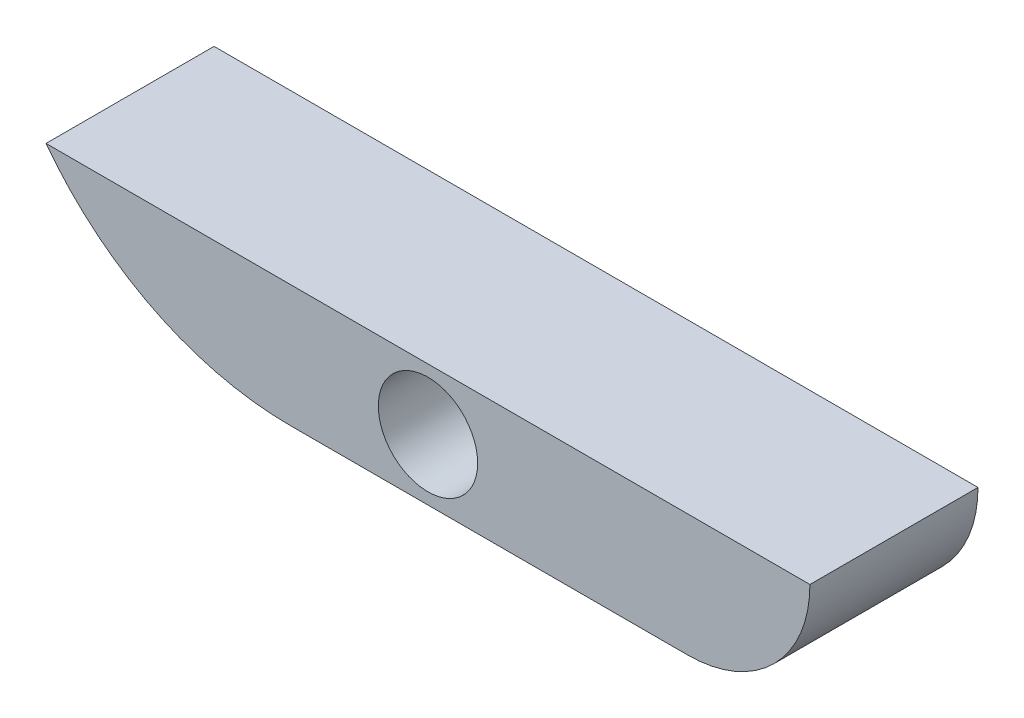
ISO-10303-21;
HEADER;
FILE_DESCRIPTION(('STEP AP214'),'2;1');
FILE_NAME('part.step','',(''),(''),'','','');
FILE_SCHEMA(('AUTOMOTIVE_DESIGN { 1 0 10303 214 1 1 1 1 }'));
ENDSEC;
DATA;
#1=APPLICATION_CONTEXT('core data for automotive mechanical design processes');
#2=APPLICATION_PROTOCOL_DEFINITION('international standard','automotive_design',2000,#1);
#3=PRODUCT_CONTEXT('',#1,'mechanical');
#4=PRODUCT('Part','Part','',(#3));
#5=PRODUCT_RELATED_PRODUCT_CATEGORY('part','',(#4));
#6=PRODUCT_DEFINITION_FORMATION('','',#4);
#7=PRODUCT_DEFINITION_CONTEXT('part definition',#1,'design');
#8=PRODUCT_DEFINITION('design','',#6,#7);
#9=PRODUCT_DEFINITION_SHAPE('','',#8);
#10=(LENGTH_UNIT() NAMED_UNIT(*) SI_UNIT(.MILLI.,.METRE.));
#11=(NAMED_UNIT(*) PLANE_ANGLE_UNIT() SI_UNIT($,.RADIAN.));
#12=(NAMED_UNIT(*) SI_UNIT($,.STERADIAN.) SOLID_ANGLE_UNIT());
#13=UNCERTAINTY_MEASURE_WITH_UNIT(LENGTH_MEASURE(1.E-05),#10,'distance_accuracy_value','');
#14=(GEOMETRIC_REPRESENTATION_CONTEXT(3) GLOBAL_UNCERTAINTY_ASSIGNED_CONTEXT((#13)) GLOBAL_UNIT_ASSIGNED_CONTEXT((#10,
#11,#12)) REPRESENTATION_CONTEXT('',''));
#15=CARTESIAN_POINT('',(0.,0.,0.));
#16=DIRECTION('',(0.,0.,1.));
#17=DIRECTION('',(1.,0.,0.));
#18=AXIS2_PLACEMENT_3D('',#15,#16,#17);
#19=CARTESIAN_POINT('',(25.,8.,5.5));
#20=DIRECTION('',(0.,0.,-1.));
#21=DIRECTION('',(-1.,0.,0.));
#22=AXIS2_PLACEMENT_3D('',#19,#20,#21);
#23=PLANE('',#22);
#24=CARTESIAN_POINT('',(0.,4.,5.5));
#25=DIRECTION('',(0.,0.,1.));
#26=DIRECTION('',(1.,0.,0.));
#27=AXIS2_PLACEMENT_3D('',#24,#25,#26);
#28=CIRCLE('',#27,3.25);
#29=CARTESIAN_POINT('',(3.25,4.,5.5));
#30=VERTEX_POINT('',#29);
#31=EDGE_CURVE('E115',#30,#30,#28,.T.);
#32=ORIENTED_EDGE('',*,*,#31,.F.);
#33=EDGE_LOOP('',(#32));
#34=FACE_BOUND('',#33,.T.);
#35=DIRECTION('',(1.,0.,0.));
#36=VECTOR('',#35,1.);
#37=CARTESIAN_POINT('',(25.,0.,5.5));
#38=LINE('',#37,#36);
#39=CARTESIAN_POINT('',(-9.,0.,5.5));
#40=VERTEX_POINT('',#39);
#41=CARTESIAN_POINT('',(17.,0.,5.5));
#42=VERTEX_POINT('',#41);
#43=EDGE_CURVE('E112',#40,#42,#38,.T.);
#44=ORIENTED_EDGE('',*,*,#43,.T.);
#45=CARTESIAN_POINT('',(17.,8.,5.5));
#46=DIRECTION('',(0.,0.,-1.));
#47=DIRECTION('',(-1.,0.,0.));
#48=AXIS2_PLACEMENT_3D('',#45,#46,#47);
#49=CIRCLE('',#48,8.);
#50=CARTESIAN_POINT('',(25.,8.,5.5));
#51=VERTEX_POINT('',#50);
#52=EDGE_CURVE('E11',#42,#51,#49,.F.);
#53=ORIENTED_EDGE('',*,*,#52,.T.);
#54=DIRECTION('',(1.,0.,0.));
#55=VECTOR('',#54,1.);
#56=CARTESIAN_POINT('',(25.,8.,5.5));
#57=LINE('',#56,#55);
#58=CARTESIAN_POINT('',(-25.,8.,5.5));
#59=VERTEX_POINT('',#58);
#60=EDGE_CURVE('E98',#59,#51,#57,.T.);
#61=ORIENTED_EDGE('',*,*,#60,.F.);
#62=CARTESIAN_POINT('',(-9.,20.,5.5));
#63=DIRECTION('',(0.,0.,-1.));
#64=DIRECTION('',(-1.,0.,0.));
#65=AXIS2_PLACEMENT_3D('',#62,#63,#64);
#66=CIRCLE('',#65,20.);
#67=EDGE_CURVE('E85',#59,#40,#66,.F.);
#68=ORIENTED_EDGE('',*,*,#67,.T.);
#69=EDGE_LOOP('',(#44,#53,#61,#68));
#70=FACE_BOUND('',#69,.T.);
#71=ADVANCED_FACE('F43',(#34,#70),#23,.F.);
#72=CARTESIAN_POINT('',(25.,8.,-5.5));
#73=DIRECTION('',(0.,0.,1.));
#74=DIRECTION('',(1.,0.,0.));
#75=AXIS2_PLACEMENT_3D('',#72,#73,#74);
#76=PLANE('',#75);
#77=CARTESIAN_POINT('',(0.,4.,-5.5));
#78=DIRECTION('',(0.,0.,1.));
#79=DIRECTION('',(1.,0.,0.));
#80=AXIS2_PLACEMENT_3D('',#77,#78,#79);
#81=CIRCLE('',#80,3.25);
#82=CARTESIAN_POINT('',(3.25,4.,-5.5));
#83=VERTEX_POINT('',#82);
#84=EDGE_CURVE('E47',#83,#83,#81,.T.);
#85=ORIENTED_EDGE('',*,*,#84,.T.);
#86=EDGE_LOOP('',(#85));
#87=FACE_BOUND('',#86,.T.);
#88=DIRECTION('',(-1.,0.,0.));
#89=VECTOR('',#88,1.);
#90=CARTESIAN_POINT('',(25.,8.,-5.5));
#91=LINE('',#90,#89);
#92=CARTESIAN_POINT('',(25.,8.,-5.5));
#93=VERTEX_POINT('',#92);
#94=CARTESIAN_POINT('',(-25.,8.,-5.5));
#95=VERTEX_POINT('',#94);
#96=EDGE_CURVE('E95',#93,#95,#91,.T.);
#97=ORIENTED_EDGE('',*,*,#96,.F.);
#98=CARTESIAN_POINT('',(17.,8.,-5.5));
#99=DIRECTION('',(0.,0.,1.));
#100=DIRECTION('',(1.,0.,0.));
#101=AXIS2_PLACEMENT_3D('',#98,#99,#100);
#102=CIRCLE('',#101,8.);
#103=CARTESIAN_POINT('',(17.,0.,-5.5));
#104=VERTEX_POINT('',#103);
#105=EDGE_CURVE('E67',#93,#104,#102,.F.);
#106=ORIENTED_EDGE('',*,*,#105,.T.);
#107=DIRECTION('',(-1.,0.,0.));
#108=VECTOR('',#107,1.);
#109=CARTESIAN_POINT('',(25.,0.,-5.5));
#110=LINE('',#109,#108);
#111=CARTESIAN_POINT('',(-9.,0.,-5.5));
#112=VERTEX_POINT('',#111);
#113=EDGE_CURVE('E109',#104,#112,#110,.T.);
#114=ORIENTED_EDGE('',*,*,#113,.T.);
#115=CARTESIAN_POINT('',(-9.,20.,-5.5));
#116=DIRECTION('',(0.,0.,1.));
#117=DIRECTION('',(1.,0.,0.));
#118=AXIS2_PLACEMENT_3D('',#115,#116,#117);
#119=CIRCLE('',#118,20.);
#120=EDGE_CURVE('E125',#112,#95,#119,.F.);
#121=ORIENTED_EDGE('',*,*,#120,.T.);
#122=EDGE_LOOP('',(#97,#106,#114,#121));
#123=FACE_BOUND('',#122,.T.);
#124=ADVANCED_FACE('F131',(#87,#123),#76,.F.);
#125=CARTESIAN_POINT('',(0.,8.,0.));
#126=DIRECTION('',(0.,-1.,0.));
#127=DIRECTION('',(0.,0.,-1.));
#128=AXIS2_PLACEMENT_3D('',#125,#126,#127);
#129=PLANE('',#128);
#130=DIRECTION('',(0.,0.,1.));
#131=VECTOR('',#130,1.);
#132=CARTESIAN_POINT('',(-25.,8.,-5.5));
#133=LINE('',#132,#131);
#134=EDGE_CURVE('E90',#95,#59,#133,.T.);
#135=ORIENTED_EDGE('',*,*,#134,.T.);
#136=ORIENTED_EDGE('',*,*,#60,.T.);
#137=DIRECTION('',(0.,0.,-1.));
#138=VECTOR('',#137,1.);
#139=CARTESIAN_POINT('',(25.,8.,-5.5));
#140=LINE('',#139,#138);
#141=EDGE_CURVE('E104',#51,#93,#140,.T.);
#142=ORIENTED_EDGE('',*,*,#141,.T.);
#143=ORIENTED_EDGE('',*,*,#96,.T.);
#144=EDGE_LOOP('',(#135,#136,#142,#143));
#145=FACE_BOUND('',#144,.T.);
#146=ADVANCED_FACE('F107',(#145),#129,.F.);
#147=CARTESIAN_POINT('',(0.,0.,0.));
#148=DIRECTION('',(0.,-1.,0.));
#149=DIRECTION('',(0.,0.,-1.));
#150=AXIS2_PLACEMENT_3D('',#147,#148,#149);
#151=PLANE('',#150);
#152=ORIENTED_EDGE('',*,*,#113,.F.);
#153=DIRECTION('',(0.,0.,-1.));
#154=VECTOR('',#153,1.);
#155=CARTESIAN_POINT('',(17.,0.,5.5));
#156=LINE('',#155,#154);
#157=EDGE_CURVE('E53',#104,#42,#156,.F.);
#158=ORIENTED_EDGE('',*,*,#157,.T.);
#159=ORIENTED_EDGE('',*,*,#43,.F.);
#160=DIRECTION('',(0.,0.,1.));
#161=VECTOR('',#160,1.);
#162=CARTESIAN_POINT('',(-9.,0.,-5.5));
#163=LINE('',#162,#161);
#164=EDGE_CURVE('E92',#40,#112,#163,.F.);
#165=ORIENTED_EDGE('',*,*,#164,.T.);
#166=EDGE_LOOP('',(#152,#158,#159,#165));
#167=FACE_BOUND('',#166,.T.);
#168=ADVANCED_FACE('F132',(#167),#151,.T.);
#169=CARTESIAN_POINT('',(-9.,20.,-5.5));
#170=DIRECTION('',(0.,0.,-1.));
#171=DIRECTION('',(-1.,0.,0.));
#172=AXIS2_PLACEMENT_3D('',#169,#170,#171);
#173=CYLINDRICAL_SURFACE('',#172,20.);
#174=ORIENTED_EDGE('',*,*,#120,.F.);
#175=ORIENTED_EDGE('',*,*,#164,.F.);
#176=ORIENTED_EDGE('',*,*,#67,.F.);
#177=ORIENTED_EDGE('',*,*,#134,.F.);
#178=EDGE_LOOP('',(#174,#175,#176,#177));
#179=FACE_BOUND('',#178,.T.);
#180=ADVANCED_FACE('F88',(#179),#173,.T.);
#181=CARTESIAN_POINT('',(17.,8.,-5.5));
#182=DIRECTION('',(0.,0.,1.));
#183=DIRECTION('',(1.,0.,0.));
#184=AXIS2_PLACEMENT_3D('',#181,#182,#183);
#185=CYLINDRICAL_SURFACE('',#184,8.);
#186=ORIENTED_EDGE('',*,*,#52,.F.);
#187=ORIENTED_EDGE('',*,*,#157,.F.);
#188=ORIENTED_EDGE('',*,*,#105,.F.);
#189=ORIENTED_EDGE('',*,*,#141,.F.);
#190=EDGE_LOOP('',(#186,#187,#188,#189));
#191=FACE_BOUND('',#190,.T.);
#192=ADVANCED_FACE('F45',(#191),#185,.T.);
#193=CARTESIAN_POINT('',(0.,4.,-15.5));
#194=DIRECTION('',(0.,0.,1.));
#195=DIRECTION('',(1.,0.,0.));
#196=AXIS2_PLACEMENT_3D('',#193,#194,#195);
#197=CYLINDRICAL_SURFACE('',#196,3.25);
#198=CARTESIAN_POINT('',(3.25,4.,5.5));
#199=CARTESIAN_POINT('',(3.25,4.,5.38541666666667));
#200=CARTESIAN_POINT('',(3.25,4.,5.27083333333333));
#201=CARTESIAN_POINT('',(3.25,4.,5.04166666666667));
#202=CARTESIAN_POINT('',(3.25,4.,4.92708333333333));
#203=CARTESIAN_POINT('',(3.25,4.,4.69791666666667));
#204=CARTESIAN_POINT('',(3.25,4.,4.58333333333333));
#205=CARTESIAN_POINT('',(3.25,4.,4.35416666666667));
#206=CARTESIAN_POINT('',(3.25,4.,4.23958333333333));
#207=CARTESIAN_POINT('',(3.25,4.,4.01041666666667));
#208=CARTESIAN_POINT('',(3.25,4.,3.89583333333333));
#209=CARTESIAN_POINT('',(3.25,4.,3.66666666666667));
#210=CARTESIAN_POINT('',(3.25,4.,3.55208333333333));
#211=CARTESIAN_POINT('',(3.25,4.,3.32291666666667));
#212=CARTESIAN_POINT('',(3.25,4.,3.20833333333334));
#213=CARTESIAN_POINT('',(3.25,4.,2.97916666666667));
#214=CARTESIAN_POINT('',(3.25,4.,2.86458333333333));
#215=CARTESIAN_POINT('',(3.25,4.,2.63541666666667));
#216=CARTESIAN_POINT('',(3.25,4.,2.52083333333333));
#217=CARTESIAN_POINT('',(3.25,4.,2.29166666666667));
#218=CARTESIAN_POINT('',(3.25,4.,2.17708333333334));
#219=CARTESIAN_POINT('',(3.25,4.,1.94791666666667));
#220=CARTESIAN_POINT('',(3.25,4.,1.83333333333334));
#221=CARTESIAN_POINT('',(3.25,4.,1.60416666666667));
#222=CARTESIAN_POINT('',(3.25,4.,1.48958333333333));
#223=CARTESIAN_POINT('',(3.25,4.,1.26041666666667));
#224=CARTESIAN_POINT('',(3.25,4.,1.14583333333333));
#225=CARTESIAN_POINT('',(3.25,4.,0.916666666666668));
#226=CARTESIAN_POINT('',(3.25,4.,0.802083333333334));
#227=CARTESIAN_POINT('',(3.25,4.,0.572916666666667));
#228=CARTESIAN_POINT('',(3.25,4.,0.458333333333334));
#229=CARTESIAN_POINT('',(3.25,4.,0.229166666666667));
#230=CARTESIAN_POINT('',(3.25,4.,0.114583333333335));
#231=CARTESIAN_POINT('',(3.25,4.,-0.114583333333332));
#232=CARTESIAN_POINT('',(3.25,4.,-0.229166666666665));
#233=CARTESIAN_POINT('',(3.25,4.,-0.458333333333332));
#234=CARTESIAN_POINT('',(3.25,4.,-0.572916666666665));
#235=CARTESIAN_POINT('',(3.25,4.,-0.802083333333332));
#236=CARTESIAN_POINT('',(3.25,4.,-0.916666666666666));
#237=CARTESIAN_POINT('',(3.25,4.,-1.14583333333333));
#238=CARTESIAN_POINT('',(3.25,4.,-1.26041666666667));
#239=CARTESIAN_POINT('',(3.25,4.,-1.48958333333333));
#240=CARTESIAN_POINT('',(3.25,4.,-1.60416666666667));
#241=CARTESIAN_POINT('',(3.25,4.,-1.83333333333333));
#242=CARTESIAN_POINT('',(3.25,4.,-1.94791666666667));
#243=CARTESIAN_POINT('',(3.25,4.,-2.17708333333333));
#244=CARTESIAN_POINT('',(3.25,4.,-2.29166666666667));
#245=CARTESIAN_POINT('',(3.25,4.,-2.52083333333333));
#246=CARTESIAN_POINT('',(3.25,4.,-2.63541666666667));
#247=CARTESIAN_POINT('',(3.25,4.,-2.86458333333333));
#248=CARTESIAN_POINT('',(3.25,4.,-2.97916666666667));
#249=CARTESIAN_POINT('',(3.25,4.,-3.20833333333333));
#250=CARTESIAN_POINT('',(3.25,4.,-3.32291666666667));
#251=CARTESIAN_POINT('',(3.25,4.,-3.55208333333333));
#252=CARTESIAN_POINT('',(3.25,4.,-3.66666666666667));
#253=CARTESIAN_POINT('',(3.25,4.,-3.89583333333333));
#254=CARTESIAN_POINT('',(3.25,4.,-4.01041666666667));
#255=CARTESIAN_POINT('',(3.25,4.,-4.23958333333333));
#256=CARTESIAN_POINT('',(3.25,4.,-4.35416666666667));
#257=CARTESIAN_POINT('',(3.25,4.,-4.58333333333333));
#258=CARTESIAN_POINT('',(3.25,4.,-4.69791666666667));
#259=CARTESIAN_POINT('',(3.25,4.,-4.92708333333333));
#260=CARTESIAN_POINT('',(3.25,4.,-5.04166666666667));
#261=CARTESIAN_POINT('',(3.25,4.,-5.27083333333333));
#262=CARTESIAN_POINT('',(3.25,4.,-5.38541666666667));
#263=CARTESIAN_POINT('',(3.25,4.,-5.5));
#264=B_SPLINE_CURVE_WITH_KNOTS('',3,(#198,#199,#200,#201,#202,#203,#204,#205,#206,#207,#208,
#209,#210,#211,#212,#213,#214,#215,#216,#217,#218,#219,#220,#221,#222,#223,#224,#225,#226,#227,
#228,#229,#230,#231,#232,#233,#234,#235,#236,#237,#238,#239,#240,#241,#242,#243,#244,#245,#246,
#247,#248,#249,#250,#251,#252,#253,#254,#255,#256,#257,#258,#259,#260,#261,#262,#263),
.UNSPECIFIED.,.F.,.F.,(4,2,2,2,2,2,2,2,2,2,2,2,2,2,2,2,2,2,2,2,2,2,2,2,2,2,2,2,2,2,2,2,4),(0.,
0.34375,0.687500000000001,1.03125,1.375,1.71875,2.0625,2.40625,2.75,3.09375,3.4375,3.78125,
4.125,4.46875,4.8125,5.15625,5.5,5.84375,6.1875,6.53125,6.875,7.21875,7.5625,7.90625,8.25,
8.59375,8.9375,9.28125,9.625,9.96875,10.3125,10.65625,11.),.UNSPECIFIED.);
#265=EDGE_CURVE('BSEAM135',#30,#83,#264,.T.);
#266=ORIENTED_EDGE('',*,*,#31,.T.);
#267=ORIENTED_EDGE('',*,*,#84,.F.);
#268=ORIENTED_EDGE('',*,*,#265,.T.);
#269=ORIENTED_EDGE('',*,*,#265,.F.);
#270=EDGE_LOOP('',(#266,#268,#267,#269));
#271=FACE_BOUND('',#270,.T.);
#272=ADVANCED_FACE('F135',(#271),#197,.F.);
#273=CLOSED_SHELL('',(#71,#124,#146,#168,#180,#192,#272));
#274=MANIFOLD_SOLID_BREP('B2',#273);
#275=ADVANCED_BREP_SHAPE_REPRESENTATION('',(#18,#274),#14);
#276=SHAPE_DEFINITION_REPRESENTATION(#9,#275);
ENDSEC;
END-ISO-10303-21;
